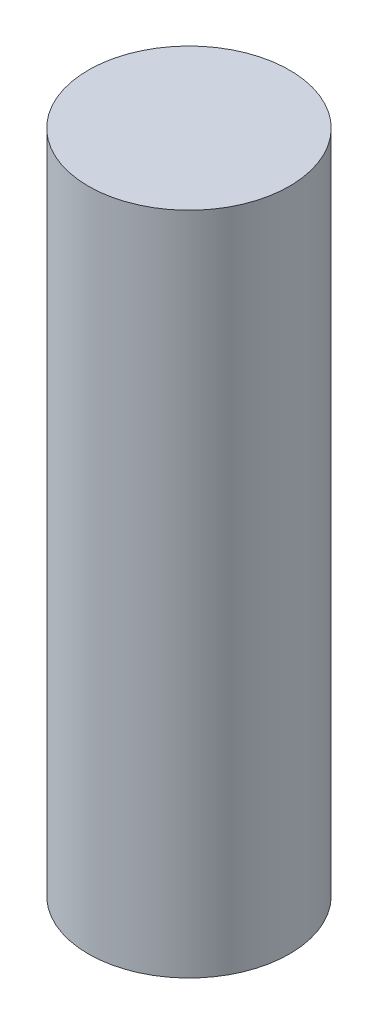
ISO-10303-21;
HEADER;
FILE_DESCRIPTION(('STEP AP214'),'2;1');
FILE_NAME('part.step','',(''),(''),'','','');
FILE_SCHEMA(('AUTOMOTIVE_DESIGN { 1 0 10303 214 1 1 1 1 }'));
ENDSEC;
DATA;
#1=APPLICATION_CONTEXT('core data for automotive mechanical design processes');
#2=APPLICATION_PROTOCOL_DEFINITION('international standard','automotive_design',2000,#1);
#3=PRODUCT_CONTEXT('',#1,'mechanical');
#4=PRODUCT('Part','Part','',(#3));
#5=PRODUCT_RELATED_PRODUCT_CATEGORY('part','',(#4));
#6=PRODUCT_DEFINITION_FORMATION('','',#4);
#7=PRODUCT_DEFINITION_CONTEXT('part definition',#1,'design');
#8=PRODUCT_DEFINITION('design','',#6,#7);
#9=PRODUCT_DEFINITION_SHAPE('','',#8);
#10=(LENGTH_UNIT() NAMED_UNIT(*) SI_UNIT(.MILLI.,.METRE.));
#11=(NAMED_UNIT(*) PLANE_ANGLE_UNIT() SI_UNIT($,.RADIAN.));
#12=(NAMED_UNIT(*) SI_UNIT($,.STERADIAN.) SOLID_ANGLE_UNIT());
#13=UNCERTAINTY_MEASURE_WITH_UNIT(LENGTH_MEASURE(1.E-05),#10,'distance_accuracy_value','');
#14=(GEOMETRIC_REPRESENTATION_CONTEXT(3) GLOBAL_UNCERTAINTY_ASSIGNED_CONTEXT((#13)) GLOBAL_UNIT_ASSIGNED_CONTEXT((#10,
#11,#12)) REPRESENTATION_CONTEXT('',''));
#15=CARTESIAN_POINT('',(0.,0.,0.));
#16=DIRECTION('',(0.,0.,1.));
#17=DIRECTION('',(1.,0.,0.));
#18=AXIS2_PLACEMENT_3D('',#15,#16,#17);
#19=CARTESIAN_POINT('',(0.,115.,0.));
#20=DIRECTION('',(0.,-1.,0.));
#21=DIRECTION('',(0.,0.,-1.));
#22=AXIS2_PLACEMENT_3D('',#19,#20,#21);
#23=CYLINDRICAL_SURFACE('',#22,17.4);
#24=CARTESIAN_POINT('',(0.,115.,0.));
#25=DIRECTION('',(0.,1.,0.));
#26=DIRECTION('',(0.,0.,1.));
#27=AXIS2_PLACEMENT_3D('',#24,#25,#26);
#28=CIRCLE('',#27,17.4);
#29=CARTESIAN_POINT('',(0.,115.,17.4));
#30=VERTEX_POINT('',#29);
#31=EDGE_CURVE('E10',#30,#30,#28,.T.);
#32=ORIENTED_EDGE('',*,*,#31,.F.);
#33=EDGE_LOOP('',(#32));
#34=FACE_BOUND('',#33,.T.);
#35=CARTESIAN_POINT('',(0.,0.,0.));
#36=DIRECTION('',(0.,1.,0.));
#37=DIRECTION('',(0.,0.,1.));
#38=AXIS2_PLACEMENT_3D('',#35,#36,#37);
#39=CIRCLE('',#38,17.4);
#40=CARTESIAN_POINT('',(0.,0.,17.4));
#41=VERTEX_POINT('',#40);
#42=EDGE_CURVE('E36',#41,#41,#39,.T.);
#43=ORIENTED_EDGE('',*,*,#42,.T.);
#44=EDGE_LOOP('',(#43));
#45=FACE_BOUND('',#44,.T.);
#46=ADVANCED_FACE('F33',(#34,#45),#23,.T.);
#47=CARTESIAN_POINT('',(0.,115.,0.));
#48=DIRECTION('',(0.,1.,0.));
#49=DIRECTION('',(0.,0.,1.));
#50=AXIS2_PLACEMENT_3D('',#47,#48,#49);
#51=PLANE('',#50);
#52=ORIENTED_EDGE('',*,*,#31,.T.);
#53=EDGE_LOOP('',(#52));
#54=FACE_BOUND('',#53,.T.);
#55=ADVANCED_FACE('F48',(#54),#51,.T.);
#56=CARTESIAN_POINT('',(0.,0.,0.));
#57=DIRECTION('',(0.,1.,0.));
#58=DIRECTION('',(0.,0.,1.));
#59=AXIS2_PLACEMENT_3D('',#56,#57,#58);
#60=PLANE('',#59);
#61=ORIENTED_EDGE('',*,*,#42,.F.);
#62=EDGE_LOOP('',(#61));
#63=FACE_BOUND('',#62,.T.);
#64=ADVANCED_FACE('F46',(#63),#60,.F.);
#65=CLOSED_SHELL('',(#46,#55,#64));
#66=MANIFOLD_SOLID_BREP('B2',#65);
#67=ADVANCED_BREP_SHAPE_REPRESENTATION('',(#18,#66),#14);
#68=SHAPE_DEFINITION_REPRESENTATION(#9,#67);
ENDSEC;
END-ISO-10303-21;
